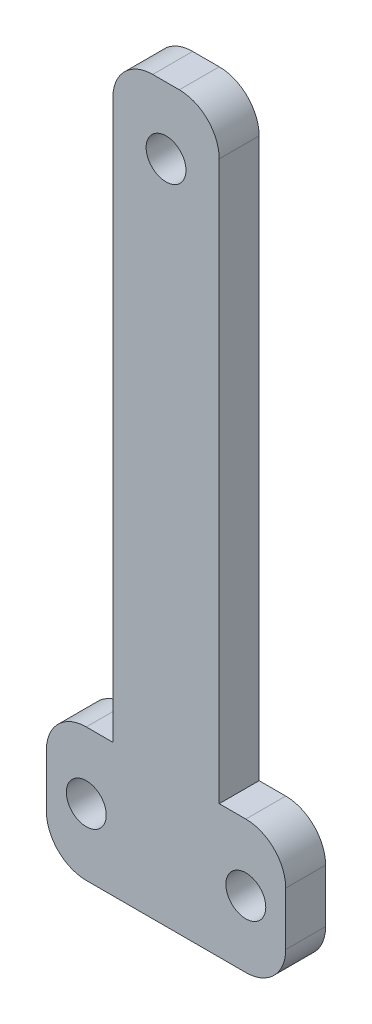
ISO-10303-21;
HEADER;
FILE_DESCRIPTION(('STEP AP214'),'2;1');
FILE_NAME('part.step','',(''),(''),'','','');
FILE_SCHEMA(('AUTOMOTIVE_DESIGN { 1 0 10303 214 1 1 1 1 }'));
ENDSEC;
DATA;
#1=APPLICATION_CONTEXT('core data for automotive mechanical design processes');
#2=APPLICATION_PROTOCOL_DEFINITION('international standard','automotive_design',2000,#1);
#3=PRODUCT_CONTEXT('',#1,'mechanical');
#4=PRODUCT('Part','Part','',(#3));
#5=PRODUCT_RELATED_PRODUCT_CATEGORY('part','',(#4));
#6=PRODUCT_DEFINITION_FORMATION('','',#4);
#7=PRODUCT_DEFINITION_CONTEXT('part definition',#1,'design');
#8=PRODUCT_DEFINITION('design','',#6,#7);
#9=PRODUCT_DEFINITION_SHAPE('','',#8);
#10=(LENGTH_UNIT() NAMED_UNIT(*) SI_UNIT(.MILLI.,.METRE.));
#11=(NAMED_UNIT(*) PLANE_ANGLE_UNIT() SI_UNIT($,.RADIAN.));
#12=(NAMED_UNIT(*) SI_UNIT($,.STERADIAN.) SOLID_ANGLE_UNIT());
#13=UNCERTAINTY_MEASURE_WITH_UNIT(LENGTH_MEASURE(1.E-05),#10,'distance_accuracy_value','');
#14=(GEOMETRIC_REPRESENTATION_CONTEXT(3) GLOBAL_UNCERTAINTY_ASSIGNED_CONTEXT((#13)) GLOBAL_UNIT_ASSIGNED_CONTEXT((#10,
#11,#12)) REPRESENTATION_CONTEXT('',''));
#15=CARTESIAN_POINT('',(0.,0.,0.));
#16=DIRECTION('',(0.,0.,1.));
#17=DIRECTION('',(1.,0.,0.));
#18=AXIS2_PLACEMENT_3D('',#15,#16,#17);
#19=CARTESIAN_POINT('',(-1.,24.5,1.5));
#20=DIRECTION('',(0.,0.,-1.));
#21=DIRECTION('',(-1.,0.,0.));
#22=AXIS2_PLACEMENT_3D('',#19,#20,#21);
#23=CYLINDRICAL_SURFACE('',#22,3.);
#24=CARTESIAN_POINT('',(-1.,24.5,-1.5));
#25=DIRECTION('',(0.,0.,1.));
#26=DIRECTION('',(1.,0.,0.));
#27=AXIS2_PLACEMENT_3D('',#24,#25,#26);
#28=CIRCLE('',#27,3.);
#29=CARTESIAN_POINT('',(-4.,24.5,-1.5));
#30=VERTEX_POINT('',#29);
#31=CARTESIAN_POINT('',(-1.,27.5,-1.5));
#32=VERTEX_POINT('',#31);
#33=EDGE_CURVE('E188',#30,#32,#28,.F.);
#34=ORIENTED_EDGE('',*,*,#33,.F.);
#35=DIRECTION('',(0.,0.,-1.));
#36=VECTOR('',#35,1.);
#37=CARTESIAN_POINT('',(-4.,24.5,1.5));
#38=LINE('',#37,#36);
#39=CARTESIAN_POINT('',(-4.,24.5,1.5));
#40=VERTEX_POINT('',#39);
#41=EDGE_CURVE('E11',#40,#30,#38,.T.);
#42=ORIENTED_EDGE('',*,*,#41,.F.);
#43=CARTESIAN_POINT('',(-1.,24.5,1.5));
#44=DIRECTION('',(0.,0.,1.));
#45=DIRECTION('',(1.,0.,0.));
#46=AXIS2_PLACEMENT_3D('',#43,#44,#45);
#47=CIRCLE('',#46,3.);
#48=CARTESIAN_POINT('',(-1.,27.5,1.5));
#49=VERTEX_POINT('',#48);
#50=EDGE_CURVE('E248',#40,#49,#47,.F.);
#51=ORIENTED_EDGE('',*,*,#50,.T.);
#52=DIRECTION('',(0.,0.,-1.));
#53=VECTOR('',#52,1.);
#54=CARTESIAN_POINT('',(-1.,27.5,1.5));
#55=LINE('',#54,#53);
#56=EDGE_CURVE('E58',#49,#32,#55,.T.);
#57=ORIENTED_EDGE('',*,*,#56,.T.);
#58=EDGE_LOOP('',(#34,#42,#51,#57));
#59=FACE_BOUND('',#58,.T.);
#60=ADVANCED_FACE('F41',(#59),#23,.T.);
#61=CARTESIAN_POINT('',(-4.,0.,1.5));
#62=DIRECTION('',(-1.,0.,0.));
#63=DIRECTION('',(0.,0.,1.));
#64=AXIS2_PLACEMENT_3D('',#61,#62,#63);
#65=PLANE('',#64);
#66=DIRECTION('',(0.,1.,0.));
#67=VECTOR('',#66,1.);
#68=CARTESIAN_POINT('',(-4.,0.,-1.5));
#69=LINE('',#68,#67);
#70=CARTESIAN_POINT('',(-4.,-17.5,-1.5));
#71=VERTEX_POINT('',#70);
#72=EDGE_CURVE('E191',#71,#30,#69,.T.);
#73=ORIENTED_EDGE('',*,*,#72,.F.);
#74=DIRECTION('',(0.,0.,-1.));
#75=VECTOR('',#74,1.);
#76=CARTESIAN_POINT('',(-4.,-17.5,1.5));
#77=LINE('',#76,#75);
#78=CARTESIAN_POINT('',(-4.,-17.5,1.5));
#79=VERTEX_POINT('',#78);
#80=EDGE_CURVE('E50',#79,#71,#77,.T.);
#81=ORIENTED_EDGE('',*,*,#80,.F.);
#82=DIRECTION('',(0.,1.,0.));
#83=VECTOR('',#82,1.);
#84=CARTESIAN_POINT('',(-4.,0.,1.5));
#85=LINE('',#84,#83);
#86=EDGE_CURVE('E550',#79,#40,#85,.T.);
#87=ORIENTED_EDGE('',*,*,#86,.T.);
#88=ORIENTED_EDGE('',*,*,#41,.T.);
#89=EDGE_LOOP('',(#73,#81,#87,#88));
#90=FACE_BOUND('',#89,.T.);
#91=ADVANCED_FACE('F293',(#90),#65,.T.);
#92=CARTESIAN_POINT('',(0.,-17.5,1.5));
#93=DIRECTION('',(0.,1.,0.));
#94=DIRECTION('',(0.,0.,1.));
#95=AXIS2_PLACEMENT_3D('',#92,#93,#94);
#96=PLANE('',#95);
#97=DIRECTION('',(1.,0.,0.));
#98=VECTOR('',#97,1.);
#99=CARTESIAN_POINT('',(0.,-17.5,-1.5));
#100=LINE('',#99,#98);
#101=CARTESIAN_POINT('',(-5.99999999999999,-17.5,-1.5));
#102=VERTEX_POINT('',#101);
#103=EDGE_CURVE('E195',#102,#71,#100,.T.);
#104=ORIENTED_EDGE('',*,*,#103,.F.);
#105=DIRECTION('',(0.,0.,-1.));
#106=VECTOR('',#105,1.);
#107=CARTESIAN_POINT('',(-5.99999999999999,-17.5,1.5));
#108=LINE('',#107,#106);
#109=CARTESIAN_POINT('',(-5.99999999999999,-17.5,1.5));
#110=VERTEX_POINT('',#109);
#111=EDGE_CURVE('E280',#110,#102,#108,.T.);
#112=ORIENTED_EDGE('',*,*,#111,.F.);
#113=DIRECTION('',(1.,0.,0.));
#114=VECTOR('',#113,1.);
#115=CARTESIAN_POINT('',(0.,-17.5,1.5));
#116=LINE('',#115,#114);
#117=EDGE_CURVE('E289',#110,#79,#116,.T.);
#118=ORIENTED_EDGE('',*,*,#117,.T.);
#119=ORIENTED_EDGE('',*,*,#80,.T.);
#120=EDGE_LOOP('',(#104,#112,#118,#119));
#121=FACE_BOUND('',#120,.T.);
#122=ADVANCED_FACE('F287',(#121),#96,.T.);
#123=CARTESIAN_POINT('',(-5.99999999999999,-20.5,1.5));
#124=DIRECTION('',(0.,0.,-1.));
#125=DIRECTION('',(-1.,0.,0.));
#126=AXIS2_PLACEMENT_3D('',#123,#124,#125);
#127=CYLINDRICAL_SURFACE('',#126,3.);
#128=CARTESIAN_POINT('',(-5.99999999999999,-20.5,-1.5));
#129=DIRECTION('',(0.,0.,1.));
#130=DIRECTION('',(1.,0.,0.));
#131=AXIS2_PLACEMENT_3D('',#128,#129,#130);
#132=CIRCLE('',#131,3.);
#133=CARTESIAN_POINT('',(-8.99999999999999,-20.5,-1.5));
#134=VERTEX_POINT('',#133);
#135=EDGE_CURVE('E199',#102,#134,#132,.T.);
#136=ORIENTED_EDGE('',*,*,#135,.T.);
#137=DIRECTION('',(0.,0.,-1.));
#138=VECTOR('',#137,1.);
#139=CARTESIAN_POINT('',(-8.99999999999999,-20.5,1.5));
#140=LINE('',#139,#138);
#141=CARTESIAN_POINT('',(-8.99999999999999,-20.5,1.5));
#142=VERTEX_POINT('',#141);
#143=EDGE_CURVE('E276',#142,#134,#140,.T.);
#144=ORIENTED_EDGE('',*,*,#143,.F.);
#145=CARTESIAN_POINT('',(-5.99999999999999,-20.5,1.5));
#146=DIRECTION('',(0.,0.,1.));
#147=DIRECTION('',(1.,0.,0.));
#148=AXIS2_PLACEMENT_3D('',#145,#146,#147);
#149=CIRCLE('',#148,3.);
#150=EDGE_CURVE('E312',#110,#142,#149,.T.);
#151=ORIENTED_EDGE('',*,*,#150,.F.);
#152=ORIENTED_EDGE('',*,*,#111,.T.);
#153=EDGE_LOOP('',(#136,#144,#151,#152));
#154=FACE_BOUND('',#153,.T.);
#155=ADVANCED_FACE('F302',(#154),#127,.T.);
#156=CARTESIAN_POINT('',(-9.,0.,1.5));
#157=DIRECTION('',(1.,0.,0.));
#158=DIRECTION('',(0.,1.,0.));
#159=AXIS2_PLACEMENT_3D('',#156,#157,#158);
#160=PLANE('',#159);
#161=DIRECTION('',(0.,-1.,0.));
#162=VECTOR('',#161,1.);
#163=CARTESIAN_POINT('',(-9.,0.,-1.5));
#164=LINE('',#163,#162);
#165=CARTESIAN_POINT('',(-8.99999999999999,-24.5,-1.5));
#166=VERTEX_POINT('',#165);
#167=EDGE_CURVE('E202',#134,#166,#164,.T.);
#168=ORIENTED_EDGE('',*,*,#167,.T.);
#169=DIRECTION('',(0.,0.,-1.));
#170=VECTOR('',#169,1.);
#171=CARTESIAN_POINT('',(-8.99999999999999,-24.5,1.5));
#172=LINE('',#171,#170);
#173=CARTESIAN_POINT('',(-8.99999999999999,-24.5,1.5));
#174=VERTEX_POINT('',#173);
#175=EDGE_CURVE('E272',#174,#166,#172,.T.);
#176=ORIENTED_EDGE('',*,*,#175,.F.);
#177=DIRECTION('',(0.,-1.,0.));
#178=VECTOR('',#177,1.);
#179=CARTESIAN_POINT('',(-9.,0.,1.5));
#180=LINE('',#179,#178);
#181=EDGE_CURVE('E308',#142,#174,#180,.T.);
#182=ORIENTED_EDGE('',*,*,#181,.F.);
#183=ORIENTED_EDGE('',*,*,#143,.T.);
#184=EDGE_LOOP('',(#168,#176,#182,#183));
#185=FACE_BOUND('',#184,.T.);
#186=ADVANCED_FACE('F306',(#185),#160,.F.);
#187=CARTESIAN_POINT('',(-5.99999999999999,-24.5,1.5));
#188=DIRECTION('',(0.,0.,-1.));
#189=DIRECTION('',(-1.,0.,0.));
#190=AXIS2_PLACEMENT_3D('',#187,#188,#189);
#191=CYLINDRICAL_SURFACE('',#190,3.);
#192=CARTESIAN_POINT('',(-5.99999999999999,-24.5,-1.5));
#193=DIRECTION('',(0.,0.,1.));
#194=DIRECTION('',(1.,0.,0.));
#195=AXIS2_PLACEMENT_3D('',#192,#193,#194);
#196=CIRCLE('',#195,3.);
#197=CARTESIAN_POINT('',(-5.99999999999999,-27.5,-1.5));
#198=VERTEX_POINT('',#197);
#199=EDGE_CURVE('E205',#166,#198,#196,.T.);
#200=ORIENTED_EDGE('',*,*,#199,.T.);
#201=DIRECTION('',(0.,0.,-1.));
#202=VECTOR('',#201,1.);
#203=CARTESIAN_POINT('',(-5.99999999999999,-27.5,1.5));
#204=LINE('',#203,#202);
#205=CARTESIAN_POINT('',(-5.99999999999999,-27.5,1.5));
#206=VERTEX_POINT('',#205);
#207=EDGE_CURVE('E268',#206,#198,#204,.T.);
#208=ORIENTED_EDGE('',*,*,#207,.F.);
#209=CARTESIAN_POINT('',(-5.99999999999999,-24.5,1.5));
#210=DIRECTION('',(0.,0.,1.));
#211=DIRECTION('',(1.,0.,0.));
#212=AXIS2_PLACEMENT_3D('',#209,#210,#211);
#213=CIRCLE('',#212,3.);
#214=EDGE_CURVE('E311',#174,#206,#213,.T.);
#215=ORIENTED_EDGE('',*,*,#214,.F.);
#216=ORIENTED_EDGE('',*,*,#175,.T.);
#217=EDGE_LOOP('',(#200,#208,#215,#216));
#218=FACE_BOUND('',#217,.T.);
#219=ADVANCED_FACE('F366',(#218),#191,.T.);
#220=CARTESIAN_POINT('',(0.,-27.5,1.5));
#221=DIRECTION('',(0.,1.,0.));
#222=DIRECTION('',(0.,0.,1.));
#223=AXIS2_PLACEMENT_3D('',#220,#221,#222);
#224=PLANE('',#223);
#225=DIRECTION('',(1.,0.,0.));
#226=VECTOR('',#225,1.);
#227=CARTESIAN_POINT('',(0.,-27.5,-1.5));
#228=LINE('',#227,#226);
#229=CARTESIAN_POINT('',(6.00000000000001,-27.5,-1.5));
#230=VERTEX_POINT('',#229);
#231=EDGE_CURVE('E208',#198,#230,#228,.T.);
#232=ORIENTED_EDGE('',*,*,#231,.T.);
#233=DIRECTION('',(0.,0.,-1.));
#234=VECTOR('',#233,1.);
#235=CARTESIAN_POINT('',(6.00000000000001,-27.5,1.5));
#236=LINE('',#235,#234);
#237=CARTESIAN_POINT('',(6.00000000000001,-27.5,1.5));
#238=VERTEX_POINT('',#237);
#239=EDGE_CURVE('E264',#238,#230,#236,.T.);
#240=ORIENTED_EDGE('',*,*,#239,.F.);
#241=DIRECTION('',(1.,0.,0.));
#242=VECTOR('',#241,1.);
#243=CARTESIAN_POINT('',(0.,-27.5,1.5));
#244=LINE('',#243,#242);
#245=EDGE_CURVE('E316',#206,#238,#244,.T.);
#246=ORIENTED_EDGE('',*,*,#245,.F.);
#247=ORIENTED_EDGE('',*,*,#207,.T.);
#248=EDGE_LOOP('',(#232,#240,#246,#247));
#249=FACE_BOUND('',#248,.T.);
#250=ADVANCED_FACE('F369',(#249),#224,.F.);
#251=CARTESIAN_POINT('',(6.00000000000001,-24.5,1.5));
#252=DIRECTION('',(0.,0.,-1.));
#253=DIRECTION('',(-1.,0.,0.));
#254=AXIS2_PLACEMENT_3D('',#251,#252,#253);
#255=CYLINDRICAL_SURFACE('',#254,3.);
#256=CARTESIAN_POINT('',(6.00000000000001,-24.5,-1.5));
#257=DIRECTION('',(0.,0.,1.));
#258=DIRECTION('',(1.,0.,0.));
#259=AXIS2_PLACEMENT_3D('',#256,#257,#258);
#260=CIRCLE('',#259,3.);
#261=CARTESIAN_POINT('',(9.00000000000001,-24.5,-1.5));
#262=VERTEX_POINT('',#261);
#263=EDGE_CURVE('E211',#230,#262,#260,.T.);
#264=ORIENTED_EDGE('',*,*,#263,.T.);
#265=DIRECTION('',(0.,0.,-1.));
#266=VECTOR('',#265,1.);
#267=CARTESIAN_POINT('',(9.00000000000001,-24.5,1.5));
#268=LINE('',#267,#266);
#269=CARTESIAN_POINT('',(9.00000000000001,-24.5,1.5));
#270=VERTEX_POINT('',#269);
#271=EDGE_CURVE('E261',#270,#262,#268,.T.);
#272=ORIENTED_EDGE('',*,*,#271,.F.);
#273=CARTESIAN_POINT('',(6.00000000000001,-24.5,1.5));
#274=DIRECTION('',(0.,0.,1.));
#275=DIRECTION('',(1.,0.,0.));
#276=AXIS2_PLACEMENT_3D('',#273,#274,#275);
#277=CIRCLE('',#276,3.);
#278=EDGE_CURVE('E323',#238,#270,#277,.T.);
#279=ORIENTED_EDGE('',*,*,#278,.F.);
#280=ORIENTED_EDGE('',*,*,#239,.T.);
#281=EDGE_LOOP('',(#264,#272,#279,#280));
#282=FACE_BOUND('',#281,.T.);
#283=ADVANCED_FACE('F373',(#282),#255,.T.);
#284=CARTESIAN_POINT('',(9.00000000000001,0.,1.5));
#285=DIRECTION('',(1.,0.,0.));
#286=DIRECTION('',(0.,1.,0.));
#287=AXIS2_PLACEMENT_3D('',#284,#285,#286);
#288=PLANE('',#287);
#289=DIRECTION('',(0.,-1.,0.));
#290=VECTOR('',#289,1.);
#291=CARTESIAN_POINT('',(9.00000000000001,0.,-1.5));
#292=LINE('',#291,#290);
#293=CARTESIAN_POINT('',(9.00000000000001,-20.5,-1.5));
#294=VERTEX_POINT('',#293);
#295=EDGE_CURVE('E215',#294,#262,#292,.T.);
#296=ORIENTED_EDGE('',*,*,#295,.F.);
#297=DIRECTION('',(0.,0.,-1.));
#298=VECTOR('',#297,1.);
#299=CARTESIAN_POINT('',(9.00000000000001,-20.5,1.5));
#300=LINE('',#299,#298);
#301=CARTESIAN_POINT('',(9.00000000000001,-20.5,1.5));
#302=VERTEX_POINT('',#301);
#303=EDGE_CURVE('E258',#302,#294,#300,.T.);
#304=ORIENTED_EDGE('',*,*,#303,.F.);
#305=DIRECTION('',(0.,-1.,0.));
#306=VECTOR('',#305,1.);
#307=CARTESIAN_POINT('',(9.00000000000001,0.,1.5));
#308=LINE('',#307,#306);
#309=EDGE_CURVE('E326',#302,#270,#308,.T.);
#310=ORIENTED_EDGE('',*,*,#309,.T.);
#311=ORIENTED_EDGE('',*,*,#271,.T.);
#312=EDGE_LOOP('',(#296,#304,#310,#311));
#313=FACE_BOUND('',#312,.T.);
#314=ADVANCED_FACE('F377',(#313),#288,.T.);
#315=CARTESIAN_POINT('',(6.00000000000001,-20.5,1.5));
#316=DIRECTION('',(0.,0.,-1.));
#317=DIRECTION('',(-1.,0.,0.));
#318=AXIS2_PLACEMENT_3D('',#315,#316,#317);
#319=CYLINDRICAL_SURFACE('',#318,3.);
#320=CARTESIAN_POINT('',(6.00000000000001,-20.5,-1.5));
#321=DIRECTION('',(0.,0.,1.));
#322=DIRECTION('',(1.,0.,0.));
#323=AXIS2_PLACEMENT_3D('',#320,#321,#322);
#324=CIRCLE('',#323,3.);
#325=CARTESIAN_POINT('',(6.00000000000001,-17.5,-1.5));
#326=VERTEX_POINT('',#325);
#327=EDGE_CURVE('E219',#326,#294,#324,.F.);
#328=ORIENTED_EDGE('',*,*,#327,.F.);
#329=DIRECTION('',(0.,0.,-1.));
#330=VECTOR('',#329,1.);
#331=CARTESIAN_POINT('',(6.00000000000001,-17.5,1.5));
#332=LINE('',#331,#330);
#333=CARTESIAN_POINT('',(6.00000000000001,-17.5,1.5));
#334=VERTEX_POINT('',#333);
#335=EDGE_CURVE('E255',#334,#326,#332,.T.);
#336=ORIENTED_EDGE('',*,*,#335,.F.);
#337=CARTESIAN_POINT('',(6.00000000000001,-20.5,1.5));
#338=DIRECTION('',(0.,0.,1.));
#339=DIRECTION('',(1.,0.,0.));
#340=AXIS2_PLACEMENT_3D('',#337,#338,#339);
#341=CIRCLE('',#340,3.);
#342=EDGE_CURVE('E330',#334,#302,#341,.F.);
#343=ORIENTED_EDGE('',*,*,#342,.T.);
#344=ORIENTED_EDGE('',*,*,#303,.T.);
#345=EDGE_LOOP('',(#328,#336,#343,#344));
#346=FACE_BOUND('',#345,.T.);
#347=ADVANCED_FACE('F381',(#346),#319,.T.);
#348=CARTESIAN_POINT('',(0.,-17.5,1.5));
#349=DIRECTION('',(0.,1.,0.));
#350=DIRECTION('',(0.,0.,1.));
#351=AXIS2_PLACEMENT_3D('',#348,#349,#350);
#352=PLANE('',#351);
#353=DIRECTION('',(1.,0.,0.));
#354=VECTOR('',#353,1.);
#355=CARTESIAN_POINT('',(0.,-17.5,-1.5));
#356=LINE('',#355,#354);
#357=CARTESIAN_POINT('',(4.,-17.5,-1.5));
#358=VERTEX_POINT('',#357);
#359=EDGE_CURVE('E223',#358,#326,#356,.T.);
#360=ORIENTED_EDGE('',*,*,#359,.F.);
#361=DIRECTION('',(0.,0.,-1.));
#362=VECTOR('',#361,1.);
#363=CARTESIAN_POINT('',(4.,-17.5,1.5));
#364=LINE('',#363,#362);
#365=CARTESIAN_POINT('',(4.,-17.5,1.5));
#366=VERTEX_POINT('',#365);
#367=EDGE_CURVE('E166',#366,#358,#364,.T.);
#368=ORIENTED_EDGE('',*,*,#367,.F.);
#369=DIRECTION('',(1.,0.,0.));
#370=VECTOR('',#369,1.);
#371=CARTESIAN_POINT('',(0.,-17.5,1.5));
#372=LINE('',#371,#370);
#373=EDGE_CURVE('E154',#366,#334,#372,.T.);
#374=ORIENTED_EDGE('',*,*,#373,.T.);
#375=ORIENTED_EDGE('',*,*,#335,.T.);
#376=EDGE_LOOP('',(#360,#368,#374,#375));
#377=FACE_BOUND('',#376,.T.);
#378=ADVANCED_FACE('F336',(#377),#352,.T.);
#379=CARTESIAN_POINT('',(4.,0.,1.5));
#380=DIRECTION('',(-1.,0.,0.));
#381=DIRECTION('',(0.,0.,1.));
#382=AXIS2_PLACEMENT_3D('',#379,#380,#381);
#383=PLANE('',#382);
#384=DIRECTION('',(0.,1.,0.));
#385=VECTOR('',#384,1.);
#386=CARTESIAN_POINT('',(4.,0.,-1.5));
#387=LINE('',#386,#385);
#388=CARTESIAN_POINT('',(4.,24.5,-1.5));
#389=VERTEX_POINT('',#388);
#390=EDGE_CURVE('E162',#358,#389,#387,.T.);
#391=ORIENTED_EDGE('',*,*,#390,.T.);
#392=DIRECTION('',(0.,0.,-1.));
#393=VECTOR('',#392,1.);
#394=CARTESIAN_POINT('',(4.,24.5,1.5));
#395=LINE('',#394,#393);
#396=CARTESIAN_POINT('',(4.,24.5,1.5));
#397=VERTEX_POINT('',#396);
#398=EDGE_CURVE('E159',#397,#389,#395,.T.);
#399=ORIENTED_EDGE('',*,*,#398,.F.);
#400=DIRECTION('',(0.,1.,0.));
#401=VECTOR('',#400,1.);
#402=CARTESIAN_POINT('',(4.,0.,1.5));
#403=LINE('',#402,#401);
#404=EDGE_CURVE('E145',#366,#397,#403,.T.);
#405=ORIENTED_EDGE('',*,*,#404,.F.);
#406=ORIENTED_EDGE('',*,*,#367,.T.);
#407=EDGE_LOOP('',(#391,#399,#405,#406));
#408=FACE_BOUND('',#407,.T.);
#409=ADVANCED_FACE('F160',(#408),#383,.F.);
#410=CARTESIAN_POINT('',(1.,24.5,1.5));
#411=DIRECTION('',(0.,0.,-1.));
#412=DIRECTION('',(-1.,0.,0.));
#413=AXIS2_PLACEMENT_3D('',#410,#411,#412);
#414=CYLINDRICAL_SURFACE('',#413,3.);
#415=CARTESIAN_POINT('',(1.,24.5,-1.5));
#416=DIRECTION('',(0.,0.,1.));
#417=DIRECTION('',(1.,0.,0.));
#418=AXIS2_PLACEMENT_3D('',#415,#416,#417);
#419=CIRCLE('',#418,3.);
#420=CARTESIAN_POINT('',(1.,27.5,-1.5));
#421=VERTEX_POINT('',#420);
#422=EDGE_CURVE('E229',#421,#389,#419,.F.);
#423=ORIENTED_EDGE('',*,*,#422,.F.);
#424=DIRECTION('',(0.,0.,-1.));
#425=VECTOR('',#424,1.);
#426=CARTESIAN_POINT('',(1.,27.5,1.5));
#427=LINE('',#426,#425);
#428=CARTESIAN_POINT('',(1.,27.5,1.5));
#429=VERTEX_POINT('',#428);
#430=EDGE_CURVE('E101',#429,#421,#427,.T.);
#431=ORIENTED_EDGE('',*,*,#430,.F.);
#432=CARTESIAN_POINT('',(1.,24.5,1.5));
#433=DIRECTION('',(0.,0.,1.));
#434=DIRECTION('',(1.,0.,0.));
#435=AXIS2_PLACEMENT_3D('',#432,#433,#434);
#436=CIRCLE('',#435,3.);
#437=EDGE_CURVE('E151',#429,#397,#436,.F.);
#438=ORIENTED_EDGE('',*,*,#437,.T.);
#439=ORIENTED_EDGE('',*,*,#398,.T.);
#440=EDGE_LOOP('',(#423,#431,#438,#439));
#441=FACE_BOUND('',#440,.T.);
#442=ADVANCED_FACE('F168',(#441),#414,.T.);
#443=CARTESIAN_POINT('',(-6.,-22.5,1.5));
#444=DIRECTION('',(0.,0.,-1.));
#445=DIRECTION('',(-1.,0.,0.));
#446=AXIS2_PLACEMENT_3D('',#443,#444,#445);
#447=CYLINDRICAL_SURFACE('',#446,1.5);
#448=CARTESIAN_POINT('',(-6.,-22.5,1.5));
#449=DIRECTION('',(0.,0.,1.));
#450=DIRECTION('',(1.,0.,0.));
#451=AXIS2_PLACEMENT_3D('',#448,#449,#450);
#452=CIRCLE('',#451,1.5);
#453=CARTESIAN_POINT('',(-4.5,-22.5,1.5));
#454=VERTEX_POINT('',#453);
#455=EDGE_CURVE('E180',#454,#454,#452,.T.);
#456=ORIENTED_EDGE('',*,*,#455,.T.);
#457=EDGE_LOOP('',(#456));
#458=FACE_BOUND('',#457,.T.);
#459=CARTESIAN_POINT('',(-6.,-22.5,-1.5));
#460=DIRECTION('',(0.,0.,1.));
#461=DIRECTION('',(1.,0.,0.));
#462=AXIS2_PLACEMENT_3D('',#459,#460,#461);
#463=CIRCLE('',#462,1.5);
#464=CARTESIAN_POINT('',(-4.5,-22.5,-1.5));
#465=VERTEX_POINT('',#464);
#466=EDGE_CURVE('E240',#465,#465,#463,.T.);
#467=ORIENTED_EDGE('',*,*,#466,.F.);
#468=EDGE_LOOP('',(#467));
#469=FACE_BOUND('',#468,.T.);
#470=ADVANCED_FACE('F349',(#458,#469),#447,.F.);
#471=CARTESIAN_POINT('',(0.,22.5,1.5));
#472=DIRECTION('',(0.,0.,-1.));
#473=DIRECTION('',(-1.,0.,0.));
#474=AXIS2_PLACEMENT_3D('',#471,#472,#473);
#475=CYLINDRICAL_SURFACE('',#474,1.5);
#476=CARTESIAN_POINT('',(0.,22.5,1.5));
#477=DIRECTION('',(0.,0.,1.));
#478=DIRECTION('',(1.,0.,0.));
#479=AXIS2_PLACEMENT_3D('',#476,#477,#478);
#480=CIRCLE('',#479,1.5);
#481=CARTESIAN_POINT('',(1.5,22.5,1.5));
#482=VERTEX_POINT('',#481);
#483=EDGE_CURVE('E173',#482,#482,#480,.T.);
#484=ORIENTED_EDGE('',*,*,#483,.T.);
#485=EDGE_LOOP('',(#484));
#486=FACE_BOUND('',#485,.T.);
#487=CARTESIAN_POINT('',(0.,22.5,-1.5));
#488=DIRECTION('',(0.,0.,1.));
#489=DIRECTION('',(1.,0.,0.));
#490=AXIS2_PLACEMENT_3D('',#487,#488,#489);
#491=CIRCLE('',#490,1.5);
#492=CARTESIAN_POINT('',(1.5,22.5,-1.5));
#493=VERTEX_POINT('',#492);
#494=EDGE_CURVE('E236',#493,#493,#491,.T.);
#495=ORIENTED_EDGE('',*,*,#494,.F.);
#496=EDGE_LOOP('',(#495));
#497=FACE_BOUND('',#496,.T.);
#498=ADVANCED_FACE('F341',(#486,#497),#475,.F.);
#499=CARTESIAN_POINT('',(0.,27.5,1.5));
#500=DIRECTION('',(0.,1.,0.));
#501=DIRECTION('',(0.,0.,1.));
#502=AXIS2_PLACEMENT_3D('',#499,#500,#501);
#503=PLANE('',#502);
#504=DIRECTION('',(1.,0.,0.));
#505=VECTOR('',#504,1.);
#506=CARTESIAN_POINT('',(0.,27.5,-1.5));
#507=LINE('',#506,#505);
#508=EDGE_CURVE('E232',#32,#421,#507,.T.);
#509=ORIENTED_EDGE('',*,*,#508,.F.);
#510=ORIENTED_EDGE('',*,*,#56,.F.);
#511=DIRECTION('',(1.,0.,0.));
#512=VECTOR('',#511,1.);
#513=CARTESIAN_POINT('',(0.,27.5,1.5));
#514=LINE('',#513,#512);
#515=EDGE_CURVE('E170',#49,#429,#514,.T.);
#516=ORIENTED_EDGE('',*,*,#515,.T.);
#517=ORIENTED_EDGE('',*,*,#430,.T.);
#518=EDGE_LOOP('',(#509,#510,#516,#517));
#519=FACE_BOUND('',#518,.T.);
#520=ADVANCED_FACE('F338',(#519),#503,.T.);
#521=CARTESIAN_POINT('',(6.,-22.5,1.5));
#522=DIRECTION('',(0.,0.,-1.));
#523=DIRECTION('',(-1.,0.,0.));
#524=AXIS2_PLACEMENT_3D('',#521,#522,#523);
#525=CYLINDRICAL_SURFACE('',#524,1.5);
#526=CARTESIAN_POINT('',(6.,-22.5,1.5));
#527=DIRECTION('',(0.,0.,1.));
#528=DIRECTION('',(1.,0.,0.));
#529=AXIS2_PLACEMENT_3D('',#526,#527,#528);
#530=CIRCLE('',#529,1.5);
#531=CARTESIAN_POINT('',(7.5,-22.5,1.5));
#532=VERTEX_POINT('',#531);
#533=EDGE_CURVE('E184',#532,#532,#530,.F.);
#534=ORIENTED_EDGE('',*,*,#533,.F.);
#535=EDGE_LOOP('',(#534));
#536=FACE_BOUND('',#535,.T.);
#537=CARTESIAN_POINT('',(6.,-22.5,-1.5));
#538=DIRECTION('',(0.,0.,1.));
#539=DIRECTION('',(1.,0.,0.));
#540=AXIS2_PLACEMENT_3D('',#537,#538,#539);
#541=CIRCLE('',#540,1.5);
#542=CARTESIAN_POINT('',(7.5,-22.5,-1.5));
#543=VERTEX_POINT('',#542);
#544=EDGE_CURVE('E244',#543,#543,#541,.F.);
#545=ORIENTED_EDGE('',*,*,#544,.T.);
#546=EDGE_LOOP('',(#545));
#547=FACE_BOUND('',#546,.T.);
#548=ADVANCED_FACE('F340',(#536,#547),#525,.F.);
#549=CARTESIAN_POINT('',(0.,0.,1.5));
#550=DIRECTION('',(0.,0.,1.));
#551=DIRECTION('',(1.,0.,0.));
#552=AXIS2_PLACEMENT_3D('',#549,#550,#551);
#553=PLANE('',#552);
#554=ORIENTED_EDGE('',*,*,#50,.F.);
#555=ORIENTED_EDGE('',*,*,#86,.F.);
#556=ORIENTED_EDGE('',*,*,#117,.F.);
#557=ORIENTED_EDGE('',*,*,#150,.T.);
#558=ORIENTED_EDGE('',*,*,#181,.T.);
#559=ORIENTED_EDGE('',*,*,#214,.T.);
#560=ORIENTED_EDGE('',*,*,#245,.T.);
#561=ORIENTED_EDGE('',*,*,#278,.T.);
#562=ORIENTED_EDGE('',*,*,#309,.F.);
#563=ORIENTED_EDGE('',*,*,#342,.F.);
#564=ORIENTED_EDGE('',*,*,#373,.F.);
#565=ORIENTED_EDGE('',*,*,#404,.T.);
#566=ORIENTED_EDGE('',*,*,#437,.F.);
#567=ORIENTED_EDGE('',*,*,#515,.F.);
#568=EDGE_LOOP('',(#554,#555,#556,#557,#558,#559,#560,#561,#562,#563,#564,#565,#566,#567));
#569=FACE_BOUND('',#568,.T.);
#570=ORIENTED_EDGE('',*,*,#483,.F.);
#571=EDGE_LOOP('',(#570));
#572=FACE_BOUND('',#571,.T.);
#573=ORIENTED_EDGE('',*,*,#455,.F.);
#574=EDGE_LOOP('',(#573));
#575=FACE_BOUND('',#574,.T.);
#576=ORIENTED_EDGE('',*,*,#533,.T.);
#577=EDGE_LOOP('',(#576));
#578=FACE_BOUND('',#577,.T.);
#579=ADVANCED_FACE('F147',(#569,#572,#575,#578),#553,.T.);
#580=CARTESIAN_POINT('',(0.,0.,-1.5));
#581=DIRECTION('',(0.,0.,1.));
#582=DIRECTION('',(1.,0.,0.));
#583=AXIS2_PLACEMENT_3D('',#580,#581,#582);
#584=PLANE('',#583);
#585=ORIENTED_EDGE('',*,*,#33,.T.);
#586=ORIENTED_EDGE('',*,*,#508,.T.);
#587=ORIENTED_EDGE('',*,*,#422,.T.);
#588=ORIENTED_EDGE('',*,*,#390,.F.);
#589=ORIENTED_EDGE('',*,*,#359,.T.);
#590=ORIENTED_EDGE('',*,*,#327,.T.);
#591=ORIENTED_EDGE('',*,*,#295,.T.);
#592=ORIENTED_EDGE('',*,*,#263,.F.);
#593=ORIENTED_EDGE('',*,*,#231,.F.);
#594=ORIENTED_EDGE('',*,*,#199,.F.);
#595=ORIENTED_EDGE('',*,*,#167,.F.);
#596=ORIENTED_EDGE('',*,*,#135,.F.);
#597=ORIENTED_EDGE('',*,*,#103,.T.);
#598=ORIENTED_EDGE('',*,*,#72,.T.);
#599=EDGE_LOOP('',(#585,#586,#587,#588,#589,#590,#591,#592,#593,#594,#595,#596,#597,#598));
#600=FACE_BOUND('',#599,.T.);
#601=ORIENTED_EDGE('',*,*,#494,.T.);
#602=EDGE_LOOP('',(#601));
#603=FACE_BOUND('',#602,.T.);
#604=ORIENTED_EDGE('',*,*,#466,.T.);
#605=EDGE_LOOP('',(#604));
#606=FACE_BOUND('',#605,.T.);
#607=ORIENTED_EDGE('',*,*,#544,.F.);
#608=EDGE_LOOP('',(#607));
#609=FACE_BOUND('',#608,.T.);
#610=ADVANCED_FACE('F296',(#600,#603,#606,#609),#584,.F.);
#611=CLOSED_SHELL('',(#60,#91,#122,#155,#186,#219,#250,#283,#314,#347,#378,#409,#442,#470,#498,
#520,#548,#579,#610));
#612=MANIFOLD_SOLID_BREP('B2',#611);
#613=ADVANCED_BREP_SHAPE_REPRESENTATION('',(#18,#612),#14);
#614=SHAPE_DEFINITION_REPRESENTATION(#9,#613);
ENDSEC;
END-ISO-10303-21;
